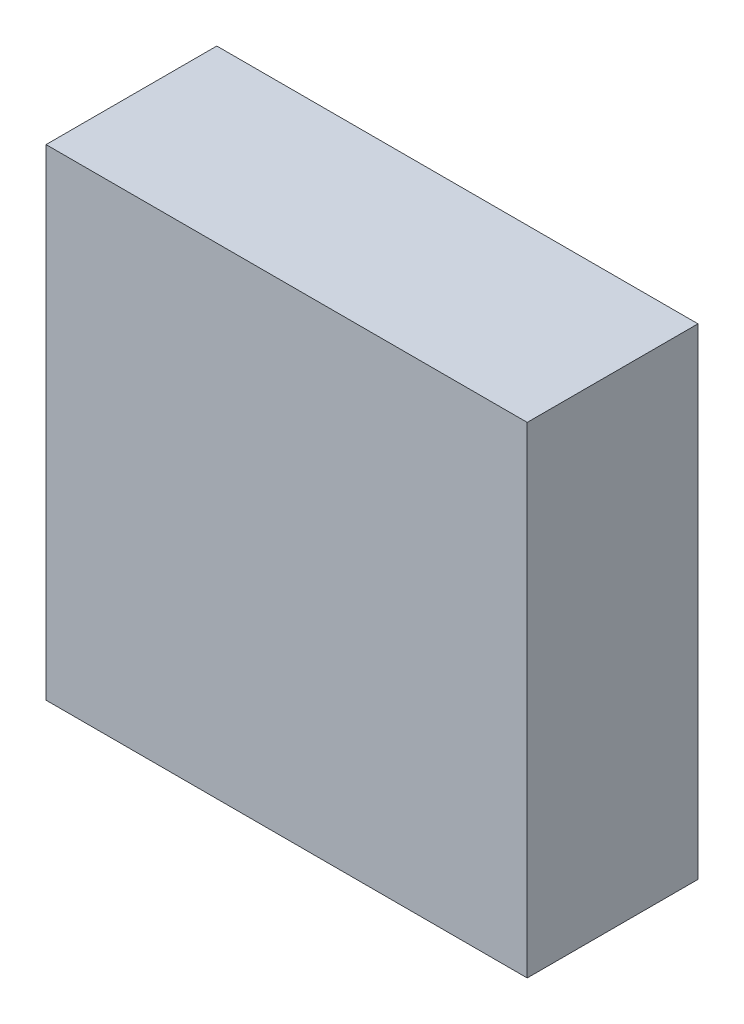
ISO-10303-21;
HEADER;
FILE_DESCRIPTION(('STEP AP214'),'2;1');
FILE_NAME('part.step','',(''),(''),'','','');
FILE_SCHEMA(('AUTOMOTIVE_DESIGN { 1 0 10303 214 1 1 1 1 }'));
ENDSEC;
DATA;
#1=APPLICATION_CONTEXT('core data for automotive mechanical design processes');
#2=APPLICATION_PROTOCOL_DEFINITION('international standard','automotive_design',2000,#1);
#3=PRODUCT_CONTEXT('',#1,'mechanical');
#4=PRODUCT('Part','Part','',(#3));
#5=PRODUCT_RELATED_PRODUCT_CATEGORY('part','',(#4));
#6=PRODUCT_DEFINITION_FORMATION('','',#4);
#7=PRODUCT_DEFINITION_CONTEXT('part definition',#1,'design');
#8=PRODUCT_DEFINITION('design','',#6,#7);
#9=PRODUCT_DEFINITION_SHAPE('','',#8);
#10=(LENGTH_UNIT() NAMED_UNIT(*) SI_UNIT(.MILLI.,.METRE.));
#11=(NAMED_UNIT(*) PLANE_ANGLE_UNIT() SI_UNIT($,.RADIAN.));
#12=(NAMED_UNIT(*) SI_UNIT($,.STERADIAN.) SOLID_ANGLE_UNIT());
#13=UNCERTAINTY_MEASURE_WITH_UNIT(LENGTH_MEASURE(1.E-05),#10,'distance_accuracy_value','');
#14=(GEOMETRIC_REPRESENTATION_CONTEXT(3) GLOBAL_UNCERTAINTY_ASSIGNED_CONTEXT((#13)) GLOBAL_UNIT_ASSIGNED_CONTEXT((#10,
#11,#12)) REPRESENTATION_CONTEXT('',''));
#15=CARTESIAN_POINT('',(0.,0.,0.));
#16=DIRECTION('',(0.,0.,1.));
#17=DIRECTION('',(1.,0.,0.));
#18=AXIS2_PLACEMENT_3D('',#15,#16,#17);
#19=CARTESIAN_POINT('',(1.55000198,1.54999944,0.));
#20=DIRECTION('',(1.,0.,0.));
#21=DIRECTION('',(0.,-1.,0.));
#22=AXIS2_PLACEMENT_3D('',#19,#20,#21);
#23=PLANE('',#22);
#24=DIRECTION('',(0.,0.,1.));
#25=VECTOR('',#24,1.);
#26=CARTESIAN_POINT('',(1.55000198,1.54999944,0.));
#27=LINE('',#26,#25);
#28=CARTESIAN_POINT('',(1.55000198,1.54999944,0.));
#29=VERTEX_POINT('',#28);
#30=CARTESIAN_POINT('',(1.55000198,1.54999944,1.10000034));
#31=VERTEX_POINT('',#30);
#32=EDGE_CURVE('E10',#29,#31,#27,.T.);
#33=ORIENTED_EDGE('',*,*,#32,.T.);
#34=DIRECTION('',(0.,-1.,0.));
#35=VECTOR('',#34,1.);
#36=CARTESIAN_POINT('',(1.55000198,1.54999944,1.10000034));
#37=LINE('',#36,#35);
#38=CARTESIAN_POINT('',(1.55000198,-1.54999944,1.10000034));
#39=VERTEX_POINT('',#38);
#40=EDGE_CURVE('E23',#31,#39,#37,.T.);
#41=ORIENTED_EDGE('',*,*,#40,.T.);
#42=DIRECTION('',(0.,0.,1.));
#43=VECTOR('',#42,1.);
#44=CARTESIAN_POINT('',(1.55000198,-1.54999944,0.));
#45=LINE('',#44,#43);
#46=CARTESIAN_POINT('',(1.55000198,-1.54999944,0.));
#47=VERTEX_POINT('',#46);
#48=EDGE_CURVE('E83',#47,#39,#45,.T.);
#49=ORIENTED_EDGE('',*,*,#48,.F.);
#50=DIRECTION('',(0.,-1.,0.));
#51=VECTOR('',#50,1.);
#52=CARTESIAN_POINT('',(1.55000198,1.54999944,0.));
#53=LINE('',#52,#51);
#54=EDGE_CURVE('E81',#29,#47,#53,.T.);
#55=ORIENTED_EDGE('',*,*,#54,.F.);
#56=EDGE_LOOP('',(#33,#41,#49,#55));
#57=FACE_BOUND('',#56,.T.);
#58=ADVANCED_FACE('F16',(#57),#23,.T.);
#59=CARTESIAN_POINT('',(1.55000198,-1.54999944,0.));
#60=DIRECTION('',(0.,-1.,0.));
#61=DIRECTION('',(-1.,0.,0.));
#62=AXIS2_PLACEMENT_3D('',#59,#60,#61);
#63=PLANE('',#62);
#64=ORIENTED_EDGE('',*,*,#48,.T.);
#65=DIRECTION('',(-1.,0.,0.));
#66=VECTOR('',#65,1.);
#67=CARTESIAN_POINT('',(1.55000198,-1.54999944,1.10000034));
#68=LINE('',#67,#66);
#69=CARTESIAN_POINT('',(-1.54999944,-1.54999944,1.10000034));
#70=VERTEX_POINT('',#69);
#71=EDGE_CURVE('E78',#39,#70,#68,.T.);
#72=ORIENTED_EDGE('',*,*,#71,.T.);
#73=DIRECTION('',(0.,0.,1.));
#74=VECTOR('',#73,1.);
#75=CARTESIAN_POINT('',(-1.54999944,-1.54999944,0.));
#76=LINE('',#75,#74);
#77=CARTESIAN_POINT('',(-1.54999944,-1.54999944,0.));
#78=VERTEX_POINT('',#77);
#79=EDGE_CURVE('E76',#78,#70,#76,.T.);
#80=ORIENTED_EDGE('',*,*,#79,.F.);
#81=DIRECTION('',(-1.,0.,0.));
#82=VECTOR('',#81,1.);
#83=CARTESIAN_POINT('',(1.55000198,-1.54999944,0.));
#84=LINE('',#83,#82);
#85=EDGE_CURVE('E67',#47,#78,#84,.T.);
#86=ORIENTED_EDGE('',*,*,#85,.F.);
#87=EDGE_LOOP('',(#64,#72,#80,#86));
#88=FACE_BOUND('',#87,.T.);
#89=ADVANCED_FACE('F89',(#88),#63,.T.);
#90=CARTESIAN_POINT('',(-1.54999944,-1.54999944,0.));
#91=DIRECTION('',(-1.,0.,0.));
#92=DIRECTION('',(0.,1.,0.));
#93=AXIS2_PLACEMENT_3D('',#90,#91,#92);
#94=PLANE('',#93);
#95=ORIENTED_EDGE('',*,*,#79,.T.);
#96=DIRECTION('',(0.,1.,0.));
#97=VECTOR('',#96,1.);
#98=CARTESIAN_POINT('',(-1.54999944,-1.54999944,1.10000034));
#99=LINE('',#98,#97);
#100=CARTESIAN_POINT('',(-1.54999944,1.54999944,1.10000034));
#101=VERTEX_POINT('',#100);
#102=EDGE_CURVE('E59',#70,#101,#99,.T.);
#103=ORIENTED_EDGE('',*,*,#102,.T.);
#104=DIRECTION('',(0.,0.,1.));
#105=VECTOR('',#104,1.);
#106=CARTESIAN_POINT('',(-1.54999944,1.54999944,0.));
#107=LINE('',#106,#105);
#108=CARTESIAN_POINT('',(-1.54999944,1.54999944,0.));
#109=VERTEX_POINT('',#108);
#110=EDGE_CURVE('E53',#109,#101,#107,.T.);
#111=ORIENTED_EDGE('',*,*,#110,.F.);
#112=DIRECTION('',(0.,1.,0.));
#113=VECTOR('',#112,1.);
#114=CARTESIAN_POINT('',(-1.54999944,-1.54999944,0.));
#115=LINE('',#114,#113);
#116=EDGE_CURVE('E57',#78,#109,#115,.T.);
#117=ORIENTED_EDGE('',*,*,#116,.F.);
#118=EDGE_LOOP('',(#95,#103,#111,#117));
#119=FACE_BOUND('',#118,.T.);
#120=ADVANCED_FACE('F56',(#119),#94,.T.);
#121=CARTESIAN_POINT('',(-1.54999944,1.54999944,0.));
#122=DIRECTION('',(0.,1.,0.));
#123=DIRECTION('',(1.,0.,0.));
#124=AXIS2_PLACEMENT_3D('',#121,#122,#123);
#125=PLANE('',#124);
#126=ORIENTED_EDGE('',*,*,#110,.T.);
#127=DIRECTION('',(1.,0.,0.));
#128=VECTOR('',#127,1.);
#129=CARTESIAN_POINT('',(-1.54999944,1.54999944,1.10000034));
#130=LINE('',#129,#128);
#131=EDGE_CURVE('E68',#101,#31,#130,.T.);
#132=ORIENTED_EDGE('',*,*,#131,.T.);
#133=ORIENTED_EDGE('',*,*,#32,.F.);
#134=DIRECTION('',(1.,0.,0.));
#135=VECTOR('',#134,1.);
#136=CARTESIAN_POINT('',(-1.54999944,1.54999944,0.));
#137=LINE('',#136,#135);
#138=EDGE_CURVE('E66',#109,#29,#137,.T.);
#139=ORIENTED_EDGE('',*,*,#138,.F.);
#140=EDGE_LOOP('',(#126,#132,#133,#139));
#141=FACE_BOUND('',#140,.T.);
#142=ADVANCED_FACE('F70',(#141),#125,.T.);
#143=CARTESIAN_POINT('',(1.269999991305E-06,0.,0.));
#144=DIRECTION('',(0.,0.,-1.));
#145=DIRECTION('',(0.,1.,0.));
#146=AXIS2_PLACEMENT_3D('',#143,#144,#145);
#147=PLANE('',#146);
#148=ORIENTED_EDGE('',*,*,#54,.T.);
#149=ORIENTED_EDGE('',*,*,#85,.T.);
#150=ORIENTED_EDGE('',*,*,#116,.T.);
#151=ORIENTED_EDGE('',*,*,#138,.T.);
#152=EDGE_LOOP('',(#148,#149,#150,#151));
#153=FACE_BOUND('',#152,.T.);
#154=ADVANCED_FACE('F65',(#153),#147,.T.);
#155=CARTESIAN_POINT('',(1.269999991305E-06,0.,1.10000034));
#156=DIRECTION('',(0.,0.,-1.));
#157=DIRECTION('',(0.,1.,0.));
#158=AXIS2_PLACEMENT_3D('',#155,#156,#157);
#159=PLANE('',#158);
#160=ORIENTED_EDGE('',*,*,#131,.F.);
#161=ORIENTED_EDGE('',*,*,#102,.F.);
#162=ORIENTED_EDGE('',*,*,#71,.F.);
#163=ORIENTED_EDGE('',*,*,#40,.F.);
#164=EDGE_LOOP('',(#160,#161,#162,#163));
#165=FACE_BOUND('',#164,.T.);
#166=ADVANCED_FACE('F90',(#165),#159,.F.);
#167=CLOSED_SHELL('',(#58,#89,#120,#142,#154,#166));
#168=MANIFOLD_SOLID_BREP('B1',#167);
#169=ADVANCED_BREP_SHAPE_REPRESENTATION('',(#18,#168),#14);
#170=SHAPE_DEFINITION_REPRESENTATION(#9,#169);
ENDSEC;
END-ISO-10303-21;
